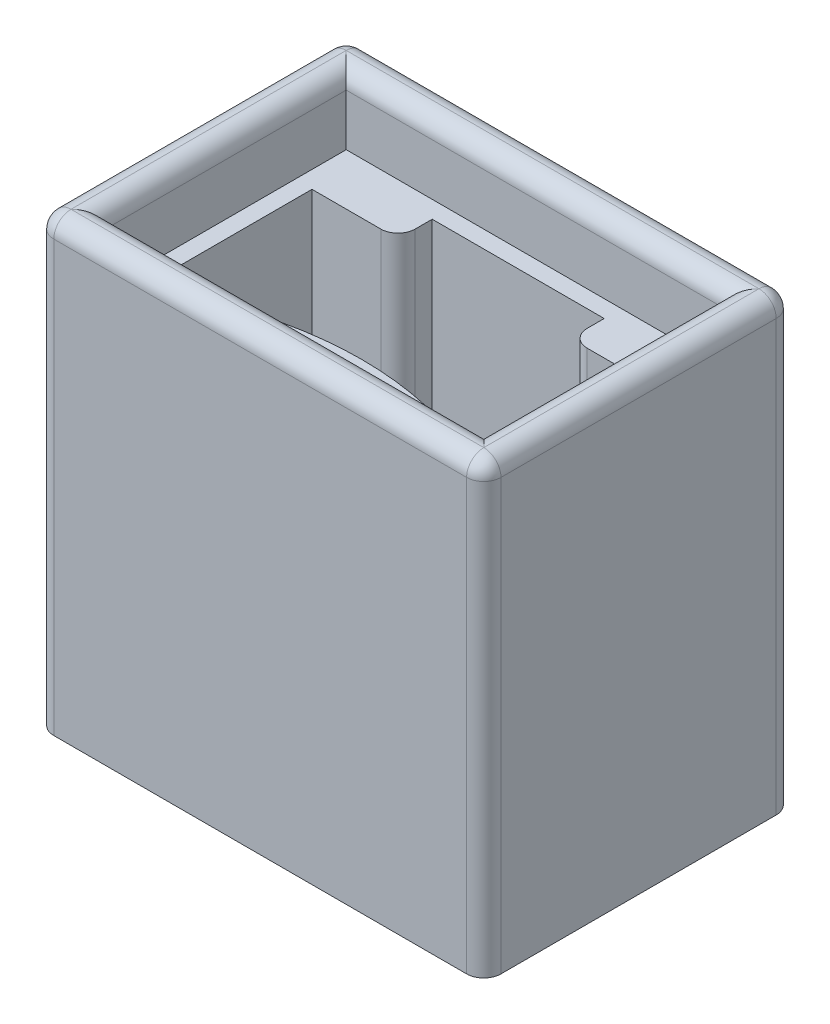
ISO-10303-21;
HEADER;
FILE_DESCRIPTION(('STEP AP214'),'2;1');
FILE_NAME('part.step','',(''),(''),'','','');
FILE_SCHEMA(('AUTOMOTIVE_DESIGN { 1 0 10303 214 1 1 1 1 }'));
ENDSEC;
DATA;
#1=APPLICATION_CONTEXT('core data for automotive mechanical design processes');
#2=APPLICATION_PROTOCOL_DEFINITION('international standard','automotive_design',2000,#1);
#3=PRODUCT_CONTEXT('',#1,'mechanical');
#4=PRODUCT('Part','Part','',(#3));
#5=PRODUCT_RELATED_PRODUCT_CATEGORY('part','',(#4));
#6=PRODUCT_DEFINITION_FORMATION('','',#4);
#7=PRODUCT_DEFINITION_CONTEXT('part definition',#1,'design');
#8=PRODUCT_DEFINITION('design','',#6,#7);
#9=PRODUCT_DEFINITION_SHAPE('','',#8);
#10=(LENGTH_UNIT() NAMED_UNIT(*) SI_UNIT(.MILLI.,.METRE.));
#11=(NAMED_UNIT(*) PLANE_ANGLE_UNIT() SI_UNIT($,.RADIAN.));
#12=(NAMED_UNIT(*) SI_UNIT($,.STERADIAN.) SOLID_ANGLE_UNIT());
#13=UNCERTAINTY_MEASURE_WITH_UNIT(LENGTH_MEASURE(1.E-05),#10,'distance_accuracy_value','');
#14=(GEOMETRIC_REPRESENTATION_CONTEXT(3) GLOBAL_UNCERTAINTY_ASSIGNED_CONTEXT((#13)) GLOBAL_UNIT_ASSIGNED_CONTEXT((#10,
#11,#12)) REPRESENTATION_CONTEXT('',''));
#15=CARTESIAN_POINT('',(0.,0.,0.));
#16=DIRECTION('',(0.,0.,1.));
#17=DIRECTION('',(1.,0.,0.));
#18=AXIS2_PLACEMENT_3D('',#15,#16,#17);
#19=CARTESIAN_POINT('',(0.,0.,0.));
#20=DIRECTION('',(0.,1.,0.));
#21=DIRECTION('',(0.,0.,1.));
#22=AXIS2_PLACEMENT_3D('',#19,#20,#21);
#23=PLANE('',#22);
#24=CARTESIAN_POINT('',(-176.825260756343,0.,123.858478650784));
#25=DIRECTION('',(0.,-1.,0.));
#26=DIRECTION('',(0.,0.,-1.));
#27=AXIS2_PLACEMENT_3D('',#24,#25,#26);
#28=CIRCLE('',#27,1.);
#29=CARTESIAN_POINT('',(-175.825260756343,0.,123.858478650784));
#30=VERTEX_POINT('',#29);
#31=CARTESIAN_POINT('',(-176.825260756343,0.,124.858478650784));
#32=VERTEX_POINT('',#31);
#33=EDGE_CURVE('E236',#30,#32,#28,.T.);
#34=ORIENTED_EDGE('',*,*,#33,.F.);
#35=DIRECTION('',(0.,0.,-1.));
#36=VECTOR('',#35,1.);
#37=CARTESIAN_POINT('',(-175.825260756343,0.,123.858478650784));
#38=LINE('',#37,#36);
#39=CARTESIAN_POINT('',(-175.825260756343,0.,122.86986711204));
#40=VERTEX_POINT('',#39);
#41=EDGE_CURVE('E229',#30,#40,#38,.T.);
#42=ORIENTED_EDGE('',*,*,#41,.T.);
#43=DIRECTION('',(1.,0.,0.));
#44=VECTOR('',#43,1.);
#45=CARTESIAN_POINT('',(-175.825260756343,0.,122.86986711204));
#46=LINE('',#45,#44);
#47=CARTESIAN_POINT('',(-165.825260756343,0.,122.86986711204));
#48=VERTEX_POINT('',#47);
#49=EDGE_CURVE('E262',#40,#48,#46,.T.);
#50=ORIENTED_EDGE('',*,*,#49,.T.);
#51=DIRECTION('',(0.,0.,-1.));
#52=VECTOR('',#51,1.);
#53=CARTESIAN_POINT('',(-165.825260756343,0.,123.858478650784));
#54=LINE('',#53,#52);
#55=CARTESIAN_POINT('',(-165.825260756343,0.,123.858478650784));
#56=VERTEX_POINT('',#55);
#57=EDGE_CURVE('E265',#56,#48,#54,.T.);
#58=ORIENTED_EDGE('',*,*,#57,.F.);
#59=CARTESIAN_POINT('',(-164.825260756343,0.,123.858478650784));
#60=DIRECTION('',(0.,1.,0.));
#61=DIRECTION('',(0.,0.,1.));
#62=AXIS2_PLACEMENT_3D('',#59,#60,#61);
#63=CIRCLE('',#62,1.);
#64=CARTESIAN_POINT('',(-164.825260756343,0.,124.858478650784));
#65=VERTEX_POINT('',#64);
#66=EDGE_CURVE('E268',#56,#65,#63,.T.);
#67=ORIENTED_EDGE('',*,*,#66,.T.);
#68=DIRECTION('',(-1.,0.,0.));
#69=VECTOR('',#68,1.);
#70=CARTESIAN_POINT('',(-160.825260756343,0.,124.858478650784));
#71=LINE('',#70,#69);
#72=CARTESIAN_POINT('',(-160.825260756343,0.,124.858478650784));
#73=VERTEX_POINT('',#72);
#74=EDGE_CURVE('E271',#73,#65,#71,.T.);
#75=ORIENTED_EDGE('',*,*,#74,.F.);
#76=DIRECTION('',(0.,0.,-1.));
#77=VECTOR('',#76,1.);
#78=CARTESIAN_POINT('',(-160.825260756343,0.,134.86986711204));
#79=LINE('',#78,#77);
#80=CARTESIAN_POINT('',(-160.825260756343,0.,134.86986711204));
#81=VERTEX_POINT('',#80);
#82=EDGE_CURVE('E274',#81,#73,#79,.T.);
#83=ORIENTED_EDGE('',*,*,#82,.F.);
#84=CARTESIAN_POINT('',(-170.825260756343,0.,150.710751296036));
#85=DIRECTION('',(0.,-1.,0.));
#86=DIRECTION('',(0.,0.,-1.));
#87=AXIS2_PLACEMENT_3D('',#84,#85,#86);
#88=CIRCLE('',#87,18.7332221395787);
#89=CARTESIAN_POINT('',(-180.825260756343,0.,134.86986711204));
#90=VERTEX_POINT('',#89);
#91=EDGE_CURVE('E277',#90,#81,#88,.T.);
#92=ORIENTED_EDGE('',*,*,#91,.F.);
#93=DIRECTION('',(0.,0.,-1.));
#94=VECTOR('',#93,1.);
#95=CARTESIAN_POINT('',(-180.825260756343,0.,134.86986711204));
#96=LINE('',#95,#94);
#97=CARTESIAN_POINT('',(-180.825260756343,0.,124.858478650784));
#98=VERTEX_POINT('',#97);
#99=EDGE_CURVE('E280',#90,#98,#96,.T.);
#100=ORIENTED_EDGE('',*,*,#99,.T.);
#101=DIRECTION('',(1.,0.,0.));
#102=VECTOR('',#101,1.);
#103=CARTESIAN_POINT('',(-180.825260756343,0.,124.858478650784));
#104=LINE('',#103,#102);
#105=EDGE_CURVE('E283',#98,#32,#104,.T.);
#106=ORIENTED_EDGE('',*,*,#105,.T.);
#107=EDGE_LOOP('',(#34,#42,#50,#58,#67,#75,#83,#92,#100,#106));
#108=FACE_BOUND('',#107,.T.);
#109=DIRECTION('',(1.,0.,0.));
#110=VECTOR('',#109,1.);
#111=CARTESIAN_POINT('',(-181.825260756343,0.,121.86986711204));
#112=LINE('',#111,#110);
#113=CARTESIAN_POINT('',(-181.825260756343,0.,121.86986711204));
#114=VERTEX_POINT('',#113);
#115=CARTESIAN_POINT('',(-159.825260756343,0.,121.86986711204));
#116=VERTEX_POINT('',#115);
#117=EDGE_CURVE('E213',#114,#116,#112,.T.);
#118=ORIENTED_EDGE('',*,*,#117,.F.);
#119=DIRECTION('',(0.,0.,-1.));
#120=VECTOR('',#119,1.);
#121=CARTESIAN_POINT('',(-181.825260756343,0.,121.86986711204));
#122=LINE('',#121,#120);
#123=CARTESIAN_POINT('',(-181.825260756343,0.,135.86986711204));
#124=VERTEX_POINT('',#123);
#125=EDGE_CURVE('E219',#124,#114,#122,.T.);
#126=ORIENTED_EDGE('',*,*,#125,.F.);
#127=DIRECTION('',(-1.,0.,0.));
#128=VECTOR('',#127,1.);
#129=CARTESIAN_POINT('',(-181.825260756343,0.,135.86986711204));
#130=LINE('',#129,#128);
#131=CARTESIAN_POINT('',(-159.825260756343,0.,135.86986711204));
#132=VERTEX_POINT('',#131);
#133=EDGE_CURVE('E222',#132,#124,#130,.T.);
#134=ORIENTED_EDGE('',*,*,#133,.F.);
#135=DIRECTION('',(0.,0.,1.));
#136=VECTOR('',#135,1.);
#137=CARTESIAN_POINT('',(-159.825260756343,0.,121.86986711204));
#138=LINE('',#137,#136);
#139=EDGE_CURVE('E204',#116,#132,#138,.T.);
#140=ORIENTED_EDGE('',*,*,#139,.F.);
#141=EDGE_LOOP('',(#118,#126,#134,#140));
#142=FACE_BOUND('',#141,.T.);
#143=ADVANCED_FACE('F36',(#108,#142),#23,.T.);
#144=CARTESIAN_POINT('',(-175.825260756343,-18.,123.858478650784));
#145=DIRECTION('',(1.,0.,0.));
#146=DIRECTION('',(0.,0.,-1.));
#147=AXIS2_PLACEMENT_3D('',#144,#145,#146);
#148=PLANE('',#147);
#149=ORIENTED_EDGE('',*,*,#41,.F.);
#150=DIRECTION('',(0.,1.,0.));
#151=VECTOR('',#150,1.);
#152=CARTESIAN_POINT('',(-175.825260756343,-18.,123.858478650784));
#153=LINE('',#152,#151);
#154=CARTESIAN_POINT('',(-175.825260756343,-18.,123.858478650784));
#155=VERTEX_POINT('',#154);
#156=EDGE_CURVE('E259',#155,#30,#153,.T.);
#157=ORIENTED_EDGE('',*,*,#156,.F.);
#158=DIRECTION('',(0.,0.,-1.));
#159=VECTOR('',#158,1.);
#160=CARTESIAN_POINT('',(-175.825260756343,-18.,123.858478650784));
#161=LINE('',#160,#159);
#162=CARTESIAN_POINT('',(-175.825260756343,-18.,122.86986711204));
#163=VERTEX_POINT('',#162);
#164=EDGE_CURVE('E232',#155,#163,#161,.T.);
#165=ORIENTED_EDGE('',*,*,#164,.T.);
#166=DIRECTION('',(0.,1.,0.));
#167=VECTOR('',#166,1.);
#168=CARTESIAN_POINT('',(-175.825260756343,-18.,122.86986711204));
#169=LINE('',#168,#167);
#170=EDGE_CURVE('E306',#163,#40,#169,.T.);
#171=ORIENTED_EDGE('',*,*,#170,.T.);
#172=EDGE_LOOP('',(#149,#157,#165,#171));
#173=FACE_BOUND('',#172,.T.);
#174=ADVANCED_FACE('F500',(#173),#148,.T.);
#175=CARTESIAN_POINT('',(-175.825260756343,-18.,122.86986711204));
#176=DIRECTION('',(0.,0.,1.));
#177=DIRECTION('',(1.,0.,0.));
#178=AXIS2_PLACEMENT_3D('',#175,#176,#177);
#179=PLANE('',#178);
#180=ORIENTED_EDGE('',*,*,#49,.F.);
#181=ORIENTED_EDGE('',*,*,#170,.F.);
#182=DIRECTION('',(1.,0.,0.));
#183=VECTOR('',#182,1.);
#184=CARTESIAN_POINT('',(-175.825260756343,-18.,122.86986711204));
#185=LINE('',#184,#183);
#186=CARTESIAN_POINT('',(-165.825260756343,-18.,122.86986711204));
#187=VERTEX_POINT('',#186);
#188=EDGE_CURVE('E235',#163,#187,#185,.T.);
#189=ORIENTED_EDGE('',*,*,#188,.T.);
#190=DIRECTION('',(0.,1.,0.));
#191=VECTOR('',#190,1.);
#192=CARTESIAN_POINT('',(-165.825260756343,-18.,122.86986711204));
#193=LINE('',#192,#191);
#194=EDGE_CURVE('E304',#187,#48,#193,.T.);
#195=ORIENTED_EDGE('',*,*,#194,.T.);
#196=EDGE_LOOP('',(#180,#181,#189,#195));
#197=FACE_BOUND('',#196,.T.);
#198=ADVANCED_FACE('F506',(#197),#179,.T.);
#199=CARTESIAN_POINT('',(-165.825260756343,-18.,123.858478650784));
#200=DIRECTION('',(1.,0.,0.));
#201=DIRECTION('',(0.,0.,-1.));
#202=AXIS2_PLACEMENT_3D('',#199,#200,#201);
#203=PLANE('',#202);
#204=ORIENTED_EDGE('',*,*,#57,.T.);
#205=ORIENTED_EDGE('',*,*,#194,.F.);
#206=DIRECTION('',(0.,0.,-1.));
#207=VECTOR('',#206,1.);
#208=CARTESIAN_POINT('',(-165.825260756343,-18.,123.858478650784));
#209=LINE('',#208,#207);
#210=CARTESIAN_POINT('',(-165.825260756343,-18.,123.858478650784));
#211=VERTEX_POINT('',#210);
#212=EDGE_CURVE('E238',#211,#187,#209,.T.);
#213=ORIENTED_EDGE('',*,*,#212,.F.);
#214=DIRECTION('',(0.,1.,0.));
#215=VECTOR('',#214,1.);
#216=CARTESIAN_POINT('',(-165.825260756343,-18.,123.858478650784));
#217=LINE('',#216,#215);
#218=EDGE_CURVE('E302',#211,#56,#217,.T.);
#219=ORIENTED_EDGE('',*,*,#218,.T.);
#220=EDGE_LOOP('',(#204,#205,#213,#219));
#221=FACE_BOUND('',#220,.T.);
#222=ADVANCED_FACE('F761',(#221),#203,.F.);
#223=CARTESIAN_POINT('',(-164.825260756343,-18.,123.858478650784));
#224=DIRECTION('',(0.,1.,0.));
#225=DIRECTION('',(0.,0.,1.));
#226=AXIS2_PLACEMENT_3D('',#223,#224,#225);
#227=CYLINDRICAL_SURFACE('',#226,1.);
#228=ORIENTED_EDGE('',*,*,#66,.F.);
#229=ORIENTED_EDGE('',*,*,#218,.F.);
#230=CARTESIAN_POINT('',(-164.825260756343,-18.,123.858478650784));
#231=DIRECTION('',(0.,1.,0.));
#232=DIRECTION('',(0.,0.,1.));
#233=AXIS2_PLACEMENT_3D('',#230,#231,#232);
#234=CIRCLE('',#233,1.);
#235=CARTESIAN_POINT('',(-164.825260756343,-18.,124.858478650784));
#236=VERTEX_POINT('',#235);
#237=EDGE_CURVE('E241',#211,#236,#234,.T.);
#238=ORIENTED_EDGE('',*,*,#237,.T.);
#239=DIRECTION('',(0.,1.,0.));
#240=VECTOR('',#239,1.);
#241=CARTESIAN_POINT('',(-164.825260756343,-18.,124.858478650784));
#242=LINE('',#241,#240);
#243=EDGE_CURVE('E300',#236,#65,#242,.T.);
#244=ORIENTED_EDGE('',*,*,#243,.T.);
#245=EDGE_LOOP('',(#228,#229,#238,#244));
#246=FACE_BOUND('',#245,.T.);
#247=ADVANCED_FACE('F751',(#246),#227,.T.);
#248=CARTESIAN_POINT('',(-160.825260756343,-18.,124.858478650784));
#249=DIRECTION('',(0.,0.,-1.));
#250=DIRECTION('',(-1.,0.,0.));
#251=AXIS2_PLACEMENT_3D('',#248,#249,#250);
#252=PLANE('',#251);
#253=ORIENTED_EDGE('',*,*,#74,.T.);
#254=ORIENTED_EDGE('',*,*,#243,.F.);
#255=DIRECTION('',(-1.,0.,0.));
#256=VECTOR('',#255,1.);
#257=CARTESIAN_POINT('',(-160.825260756343,-18.,124.858478650784));
#258=LINE('',#257,#256);
#259=CARTESIAN_POINT('',(-160.825260756343,-18.,124.858478650784));
#260=VERTEX_POINT('',#259);
#261=EDGE_CURVE('E243',#260,#236,#258,.T.);
#262=ORIENTED_EDGE('',*,*,#261,.F.);
#263=DIRECTION('',(0.,1.,0.));
#264=VECTOR('',#263,1.);
#265=CARTESIAN_POINT('',(-160.825260756343,-18.,124.858478650784));
#266=LINE('',#265,#264);
#267=EDGE_CURVE('E298',#260,#73,#266,.T.);
#268=ORIENTED_EDGE('',*,*,#267,.T.);
#269=EDGE_LOOP('',(#253,#254,#262,#268));
#270=FACE_BOUND('',#269,.T.);
#271=ADVANCED_FACE('F741',(#270),#252,.F.);
#272=CARTESIAN_POINT('',(-160.825260756343,-18.,134.86986711204));
#273=DIRECTION('',(1.,0.,0.));
#274=DIRECTION('',(0.,0.,-1.));
#275=AXIS2_PLACEMENT_3D('',#272,#273,#274);
#276=PLANE('',#275);
#277=ORIENTED_EDGE('',*,*,#82,.T.);
#278=ORIENTED_EDGE('',*,*,#267,.F.);
#279=DIRECTION('',(0.,0.,-1.));
#280=VECTOR('',#279,1.);
#281=CARTESIAN_POINT('',(-160.825260756343,-18.,134.86986711204));
#282=LINE('',#281,#280);
#283=CARTESIAN_POINT('',(-160.825260756343,-18.,134.86986711204));
#284=VERTEX_POINT('',#283);
#285=EDGE_CURVE('E246',#284,#260,#282,.T.);
#286=ORIENTED_EDGE('',*,*,#285,.F.);
#287=DIRECTION('',(0.,1.,0.));
#288=VECTOR('',#287,1.);
#289=CARTESIAN_POINT('',(-160.825260756343,-18.,134.86986711204));
#290=LINE('',#289,#288);
#291=EDGE_CURVE('E296',#284,#81,#290,.T.);
#292=ORIENTED_EDGE('',*,*,#291,.T.);
#293=EDGE_LOOP('',(#277,#278,#286,#292));
#294=FACE_BOUND('',#293,.T.);
#295=ADVANCED_FACE('F731',(#294),#276,.F.);
#296=CARTESIAN_POINT('',(-170.825260756343,-18.,150.710751296036));
#297=DIRECTION('',(0.,1.,0.));
#298=DIRECTION('',(0.,0.,1.));
#299=AXIS2_PLACEMENT_3D('',#296,#297,#298);
#300=CYLINDRICAL_SURFACE('',#299,18.7332221395787);
#301=ORIENTED_EDGE('',*,*,#91,.T.);
#302=ORIENTED_EDGE('',*,*,#291,.F.);
#303=CARTESIAN_POINT('',(-170.825260756343,-18.,150.710751296036));
#304=DIRECTION('',(0.,-1.,0.));
#305=DIRECTION('',(0.,0.,-1.));
#306=AXIS2_PLACEMENT_3D('',#303,#304,#305);
#307=CIRCLE('',#306,18.7332221395787);
#308=CARTESIAN_POINT('',(-180.825260756343,-18.,134.86986711204));
#309=VERTEX_POINT('',#308);
#310=EDGE_CURVE('E249',#309,#284,#307,.T.);
#311=ORIENTED_EDGE('',*,*,#310,.F.);
#312=DIRECTION('',(0.,1.,0.));
#313=VECTOR('',#312,1.);
#314=CARTESIAN_POINT('',(-180.825260756343,-18.,134.86986711204));
#315=LINE('',#314,#313);
#316=EDGE_CURVE('E294',#309,#90,#315,.T.);
#317=ORIENTED_EDGE('',*,*,#316,.T.);
#318=EDGE_LOOP('',(#301,#302,#311,#317));
#319=FACE_BOUND('',#318,.T.);
#320=ADVANCED_FACE('F721',(#319),#300,.T.);
#321=CARTESIAN_POINT('',(-180.825260756343,-18.,134.86986711204));
#322=DIRECTION('',(1.,0.,0.));
#323=DIRECTION('',(0.,0.,-1.));
#324=AXIS2_PLACEMENT_3D('',#321,#322,#323);
#325=PLANE('',#324);
#326=ORIENTED_EDGE('',*,*,#99,.F.);
#327=ORIENTED_EDGE('',*,*,#316,.F.);
#328=DIRECTION('',(0.,0.,-1.));
#329=VECTOR('',#328,1.);
#330=CARTESIAN_POINT('',(-180.825260756343,-18.,134.86986711204));
#331=LINE('',#330,#329);
#332=CARTESIAN_POINT('',(-180.825260756343,-18.,124.858478650784));
#333=VERTEX_POINT('',#332);
#334=EDGE_CURVE('E252',#309,#333,#331,.T.);
#335=ORIENTED_EDGE('',*,*,#334,.T.);
#336=DIRECTION('',(0.,1.,0.));
#337=VECTOR('',#336,1.);
#338=CARTESIAN_POINT('',(-180.825260756343,-18.,124.858478650784));
#339=LINE('',#338,#337);
#340=EDGE_CURVE('E292',#333,#98,#339,.T.);
#341=ORIENTED_EDGE('',*,*,#340,.T.);
#342=EDGE_LOOP('',(#326,#327,#335,#341));
#343=FACE_BOUND('',#342,.T.);
#344=ADVANCED_FACE('F711',(#343),#325,.T.);
#345=CARTESIAN_POINT('',(-180.825260756343,-18.,124.858478650784));
#346=DIRECTION('',(0.,0.,1.));
#347=DIRECTION('',(1.,0.,0.));
#348=AXIS2_PLACEMENT_3D('',#345,#346,#347);
#349=PLANE('',#348);
#350=ORIENTED_EDGE('',*,*,#105,.F.);
#351=ORIENTED_EDGE('',*,*,#340,.F.);
#352=DIRECTION('',(1.,0.,0.));
#353=VECTOR('',#352,1.);
#354=CARTESIAN_POINT('',(-180.825260756343,-18.,124.858478650784));
#355=LINE('',#354,#353);
#356=CARTESIAN_POINT('',(-176.825260756343,-18.,124.858478650784));
#357=VERTEX_POINT('',#356);
#358=EDGE_CURVE('E254',#333,#357,#355,.T.);
#359=ORIENTED_EDGE('',*,*,#358,.T.);
#360=DIRECTION('',(0.,1.,0.));
#361=VECTOR('',#360,1.);
#362=CARTESIAN_POINT('',(-176.825260756343,-18.,124.858478650784));
#363=LINE('',#362,#361);
#364=EDGE_CURVE('E290',#357,#32,#363,.T.);
#365=ORIENTED_EDGE('',*,*,#364,.T.);
#366=EDGE_LOOP('',(#350,#351,#359,#365));
#367=FACE_BOUND('',#366,.T.);
#368=ADVANCED_FACE('F701',(#367),#349,.T.);
#369=CARTESIAN_POINT('',(-176.825260756343,-18.,123.858478650784));
#370=DIRECTION('',(0.,1.,0.));
#371=DIRECTION('',(0.,0.,1.));
#372=AXIS2_PLACEMENT_3D('',#369,#370,#371);
#373=CYLINDRICAL_SURFACE('',#372,1.);
#374=ORIENTED_EDGE('',*,*,#33,.T.);
#375=ORIENTED_EDGE('',*,*,#364,.F.);
#376=CARTESIAN_POINT('',(-176.825260756343,-18.,123.858478650784));
#377=DIRECTION('',(0.,-1.,0.));
#378=DIRECTION('',(0.,0.,-1.));
#379=AXIS2_PLACEMENT_3D('',#376,#377,#378);
#380=CIRCLE('',#379,1.);
#381=EDGE_CURVE('E256',#155,#357,#380,.T.);
#382=ORIENTED_EDGE('',*,*,#381,.F.);
#383=ORIENTED_EDGE('',*,*,#156,.T.);
#384=EDGE_LOOP('',(#374,#375,#382,#383));
#385=FACE_BOUND('',#384,.T.);
#386=ADVANCED_FACE('F495',(#385),#373,.T.);
#387=CARTESIAN_POINT('',(-164.825260756343,-18.,123.858478650784));
#388=DIRECTION('',(0.,1.,0.));
#389=DIRECTION('',(0.,0.,1.));
#390=AXIS2_PLACEMENT_3D('',#387,#388,#389);
#391=PLANE('',#390);
#392=ORIENTED_EDGE('',*,*,#164,.F.);
#393=ORIENTED_EDGE('',*,*,#381,.T.);
#394=ORIENTED_EDGE('',*,*,#358,.F.);
#395=ORIENTED_EDGE('',*,*,#334,.F.);
#396=ORIENTED_EDGE('',*,*,#310,.T.);
#397=ORIENTED_EDGE('',*,*,#285,.T.);
#398=ORIENTED_EDGE('',*,*,#261,.T.);
#399=ORIENTED_EDGE('',*,*,#237,.F.);
#400=ORIENTED_EDGE('',*,*,#212,.T.);
#401=ORIENTED_EDGE('',*,*,#188,.F.);
#402=EDGE_LOOP('',(#392,#393,#394,#395,#396,#397,#398,#399,#400,#401));
#403=FACE_BOUND('',#402,.T.);
#404=ADVANCED_FACE('F488',(#403),#391,.T.);
#405=CARTESIAN_POINT('',(-181.825260756343,4.,121.86986711204));
#406=DIRECTION('',(-1.,0.,0.));
#407=DIRECTION('',(0.,0.,1.));
#408=AXIS2_PLACEMENT_3D('',#405,#406,#407);
#409=PLANE('',#408);
#410=DIRECTION('',(0.,-1.,0.));
#411=VECTOR('',#410,1.);
#412=CARTESIAN_POINT('',(-181.825260756343,4.,121.86986711204));
#413=LINE('',#412,#411);
#414=CARTESIAN_POINT('',(-181.825260756343,3.,121.86986711204));
#415=VERTEX_POINT('',#414);
#416=EDGE_CURVE('E210',#415,#114,#413,.T.);
#417=ORIENTED_EDGE('',*,*,#416,.F.);
#418=DIRECTION('',(0.,0.,-1.));
#419=VECTOR('',#418,1.);
#420=CARTESIAN_POINT('',(-181.825260756343,3.,135.86986711204));
#421=LINE('',#420,#419);
#422=CARTESIAN_POINT('',(-181.825260756343,3.,135.86986711204));
#423=VERTEX_POINT('',#422);
#424=EDGE_CURVE('E337',#415,#423,#421,.F.);
#425=ORIENTED_EDGE('',*,*,#424,.T.);
#426=DIRECTION('',(0.,-1.,0.));
#427=VECTOR('',#426,1.);
#428=CARTESIAN_POINT('',(-181.825260756343,4.,135.86986711204));
#429=LINE('',#428,#427);
#430=EDGE_CURVE('E227',#423,#124,#429,.T.);
#431=ORIENTED_EDGE('',*,*,#430,.T.);
#432=ORIENTED_EDGE('',*,*,#125,.T.);
#433=EDGE_LOOP('',(#417,#425,#431,#432));
#434=FACE_BOUND('',#433,.T.);
#435=ADVANCED_FACE('F486',(#434),#409,.F.);
#436=CARTESIAN_POINT('',(-181.825260756343,4.,135.86986711204));
#437=DIRECTION('',(0.,0.,1.));
#438=DIRECTION('',(1.,0.,0.));
#439=AXIS2_PLACEMENT_3D('',#436,#437,#438);
#440=PLANE('',#439);
#441=ORIENTED_EDGE('',*,*,#430,.F.);
#442=DIRECTION('',(-1.,0.,0.));
#443=VECTOR('',#442,1.);
#444=CARTESIAN_POINT('',(-159.825260756343,3.,135.86986711204));
#445=LINE('',#444,#443);
#446=CARTESIAN_POINT('',(-159.825260756343,3.,135.86986711204));
#447=VERTEX_POINT('',#446);
#448=EDGE_CURVE('E331',#423,#447,#445,.F.);
#449=ORIENTED_EDGE('',*,*,#448,.T.);
#450=DIRECTION('',(0.,-1.,0.));
#451=VECTOR('',#450,1.);
#452=CARTESIAN_POINT('',(-159.825260756343,4.,135.86986711204));
#453=LINE('',#452,#451);
#454=EDGE_CURVE('E209',#447,#132,#453,.T.);
#455=ORIENTED_EDGE('',*,*,#454,.T.);
#456=ORIENTED_EDGE('',*,*,#133,.T.);
#457=EDGE_LOOP('',(#441,#449,#455,#456));
#458=FACE_BOUND('',#457,.T.);
#459=ADVANCED_FACE('F484',(#458),#440,.F.);
#460=CARTESIAN_POINT('',(-159.825260756343,4.,121.86986711204));
#461=DIRECTION('',(1.,0.,0.));
#462=DIRECTION('',(0.,0.,-1.));
#463=AXIS2_PLACEMENT_3D('',#460,#461,#462);
#464=PLANE('',#463);
#465=ORIENTED_EDGE('',*,*,#454,.F.);
#466=DIRECTION('',(0.,0.,1.));
#467=VECTOR('',#466,1.);
#468=CARTESIAN_POINT('',(-159.825260756343,3.,121.86986711204));
#469=LINE('',#468,#467);
#470=CARTESIAN_POINT('',(-159.825260756343,3.,121.86986711204));
#471=VERTEX_POINT('',#470);
#472=EDGE_CURVE('E206',#447,#471,#469,.F.);
#473=ORIENTED_EDGE('',*,*,#472,.T.);
#474=DIRECTION('',(0.,-1.,0.));
#475=VECTOR('',#474,1.);
#476=CARTESIAN_POINT('',(-159.825260756343,4.,121.86986711204));
#477=LINE('',#476,#475);
#478=EDGE_CURVE('E199',#471,#116,#477,.T.);
#479=ORIENTED_EDGE('',*,*,#478,.T.);
#480=ORIENTED_EDGE('',*,*,#139,.T.);
#481=EDGE_LOOP('',(#465,#473,#479,#480));
#482=FACE_BOUND('',#481,.T.);
#483=ADVANCED_FACE('F202',(#482),#464,.F.);
#484=CARTESIAN_POINT('',(-181.825260756343,4.,121.86986711204));
#485=DIRECTION('',(0.,0.,-1.));
#486=DIRECTION('',(-1.,0.,0.));
#487=AXIS2_PLACEMENT_3D('',#484,#485,#486);
#488=PLANE('',#487);
#489=ORIENTED_EDGE('',*,*,#478,.F.);
#490=DIRECTION('',(1.,0.,0.));
#491=VECTOR('',#490,1.);
#492=CARTESIAN_POINT('',(-181.825260756343,3.,121.86986711204));
#493=LINE('',#492,#491);
#494=EDGE_CURVE('E335',#471,#415,#493,.F.);
#495=ORIENTED_EDGE('',*,*,#494,.T.);
#496=ORIENTED_EDGE('',*,*,#416,.T.);
#497=ORIENTED_EDGE('',*,*,#117,.T.);
#498=EDGE_LOOP('',(#489,#495,#496,#497));
#499=FACE_BOUND('',#498,.T.);
#500=ADVANCED_FACE('F214',(#499),#488,.F.);
#501=CARTESIAN_POINT('',(0.,-22.,0.));
#502=DIRECTION('',(0.,1.,0.));
#503=DIRECTION('',(0.,0.,1.));
#504=AXIS2_PLACEMENT_3D('',#501,#502,#503);
#505=PLANE('',#504);
#506=DIRECTION('',(0.,0.,1.));
#507=VECTOR('',#506,1.);
#508=CARTESIAN_POINT('',(-157.825260756343,-22.,119.86986711204));
#509=LINE('',#508,#507);
#510=CARTESIAN_POINT('',(-157.825260756343,-22.,120.86986711204));
#511=VERTEX_POINT('',#510);
#512=CARTESIAN_POINT('',(-157.825260756343,-22.,136.86986711204));
#513=VERTEX_POINT('',#512);
#514=EDGE_CURVE('E315',#511,#513,#509,.T.);
#515=ORIENTED_EDGE('',*,*,#514,.T.);
#516=CARTESIAN_POINT('',(-158.825260756343,-22.,136.86986711204));
#517=DIRECTION('',(0.,1.,0.));
#518=DIRECTION('',(0.,0.,1.));
#519=AXIS2_PLACEMENT_3D('',#516,#517,#518);
#520=CIRCLE('',#519,1.);
#521=CARTESIAN_POINT('',(-158.825260756343,-22.,137.86986711204));
#522=VERTEX_POINT('',#521);
#523=EDGE_CURVE('E397',#513,#522,#520,.F.);
#524=ORIENTED_EDGE('',*,*,#523,.T.);
#525=DIRECTION('',(1.,0.,0.));
#526=VECTOR('',#525,1.);
#527=CARTESIAN_POINT('',(-183.825260756343,-22.,137.86986711204));
#528=LINE('',#527,#526);
#529=CARTESIAN_POINT('',(-182.825260756343,-22.,137.86986711204));
#530=VERTEX_POINT('',#529);
#531=EDGE_CURVE('E312',#530,#522,#528,.T.);
#532=ORIENTED_EDGE('',*,*,#531,.F.);
#533=CARTESIAN_POINT('',(-182.825260756343,-22.,136.86986711204));
#534=DIRECTION('',(0.,1.,0.));
#535=DIRECTION('',(0.,0.,1.));
#536=AXIS2_PLACEMENT_3D('',#533,#534,#535);
#537=CIRCLE('',#536,1.);
#538=CARTESIAN_POINT('',(-183.825260756343,-22.,136.86986711204));
#539=VERTEX_POINT('',#538);
#540=EDGE_CURVE('E395',#530,#539,#537,.F.);
#541=ORIENTED_EDGE('',*,*,#540,.T.);
#542=DIRECTION('',(0.,0.,1.));
#543=VECTOR('',#542,1.);
#544=CARTESIAN_POINT('',(-183.825260756343,-22.,119.86986711204));
#545=LINE('',#544,#543);
#546=CARTESIAN_POINT('',(-183.825260756343,-22.,120.86986711204));
#547=VERTEX_POINT('',#546);
#548=EDGE_CURVE('E309',#547,#539,#545,.T.);
#549=ORIENTED_EDGE('',*,*,#548,.F.);
#550=CARTESIAN_POINT('',(-182.825260756343,-22.,120.86986711204));
#551=DIRECTION('',(0.,1.,0.));
#552=DIRECTION('',(0.,0.,1.));
#553=AXIS2_PLACEMENT_3D('',#550,#551,#552);
#554=CIRCLE('',#553,1.);
#555=CARTESIAN_POINT('',(-182.825260756343,-22.,119.86986711204));
#556=VERTEX_POINT('',#555);
#557=EDGE_CURVE('E59',#547,#556,#554,.F.);
#558=ORIENTED_EDGE('',*,*,#557,.T.);
#559=DIRECTION('',(1.,0.,0.));
#560=VECTOR('',#559,1.);
#561=CARTESIAN_POINT('',(-183.825260756343,-22.,119.86986711204));
#562=LINE('',#561,#560);
#563=CARTESIAN_POINT('',(-158.825260756343,-22.,119.86986711204));
#564=VERTEX_POINT('',#563);
#565=EDGE_CURVE('E318',#556,#564,#562,.T.);
#566=ORIENTED_EDGE('',*,*,#565,.T.);
#567=CARTESIAN_POINT('',(-158.825260756343,-22.,120.86986711204));
#568=DIRECTION('',(0.,1.,0.));
#569=DIRECTION('',(0.,0.,1.));
#570=AXIS2_PLACEMENT_3D('',#567,#568,#569);
#571=CIRCLE('',#570,1.);
#572=EDGE_CURVE('E392',#564,#511,#571,.F.);
#573=ORIENTED_EDGE('',*,*,#572,.T.);
#574=EDGE_LOOP('',(#515,#524,#532,#541,#549,#558,#566,#573));
#575=FACE_BOUND('',#574,.T.);
#576=ADVANCED_FACE('F463',(#575),#505,.F.);
#577=CARTESIAN_POINT('',(-183.825260756343,-22.,119.86986711204));
#578=DIRECTION('',(0.,0.,1.));
#579=DIRECTION('',(1.,0.,0.));
#580=AXIS2_PLACEMENT_3D('',#577,#578,#579);
#581=PLANE('',#580);
#582=ORIENTED_EDGE('',*,*,#565,.F.);
#583=DIRECTION('',(0.,1.,0.));
#584=VECTOR('',#583,1.);
#585=CARTESIAN_POINT('',(-182.825260756343,3.,119.86986711204));
#586=LINE('',#585,#584);
#587=CARTESIAN_POINT('',(-182.825260756343,3.,119.86986711204));
#588=VERTEX_POINT('',#587);
#589=EDGE_CURVE('E11',#556,#588,#586,.T.);
#590=ORIENTED_EDGE('',*,*,#589,.T.);
#591=DIRECTION('',(1.,0.,0.));
#592=VECTOR('',#591,1.);
#593=CARTESIAN_POINT('',(-157.825260756343,3.,119.86986711204));
#594=LINE('',#593,#592);
#595=CARTESIAN_POINT('',(-158.825260756343,3.,119.86986711204));
#596=VERTEX_POINT('',#595);
#597=EDGE_CURVE('E320',#588,#596,#594,.T.);
#598=ORIENTED_EDGE('',*,*,#597,.T.);
#599=DIRECTION('',(0.,1.,0.));
#600=VECTOR('',#599,1.);
#601=CARTESIAN_POINT('',(-158.825260756343,-22.,119.86986711204));
#602=LINE('',#601,#600);
#603=EDGE_CURVE('E45',#596,#564,#602,.F.);
#604=ORIENTED_EDGE('',*,*,#603,.T.);
#605=EDGE_LOOP('',(#582,#590,#598,#604));
#606=FACE_BOUND('',#605,.T.);
#607=ADVANCED_FACE('F424',(#606),#581,.F.);
#608=CARTESIAN_POINT('',(-157.825260756343,-22.,119.86986711204));
#609=DIRECTION('',(-1.,0.,0.));
#610=DIRECTION('',(0.,0.,1.));
#611=AXIS2_PLACEMENT_3D('',#608,#609,#610);
#612=PLANE('',#611);
#613=DIRECTION('',(0.,0.,1.));
#614=VECTOR('',#613,1.);
#615=CARTESIAN_POINT('',(-157.825260756343,3.,137.86986711204));
#616=LINE('',#615,#614);
#617=CARTESIAN_POINT('',(-157.825260756343,3.,120.86986711204));
#618=VERTEX_POINT('',#617);
#619=CARTESIAN_POINT('',(-157.825260756343,3.,136.86986711204));
#620=VERTEX_POINT('',#619);
#621=EDGE_CURVE('E322',#618,#620,#616,.T.);
#622=ORIENTED_EDGE('',*,*,#621,.T.);
#623=DIRECTION('',(0.,1.,0.));
#624=VECTOR('',#623,1.);
#625=CARTESIAN_POINT('',(-157.825260756343,-22.,136.86986711204));
#626=LINE('',#625,#624);
#627=EDGE_CURVE('E390',#620,#513,#626,.F.);
#628=ORIENTED_EDGE('',*,*,#627,.T.);
#629=ORIENTED_EDGE('',*,*,#514,.F.);
#630=DIRECTION('',(0.,1.,0.));
#631=VECTOR('',#630,1.);
#632=CARTESIAN_POINT('',(-157.825260756343,-22.,120.86986711204));
#633=LINE('',#632,#631);
#634=EDGE_CURVE('E388',#511,#618,#633,.T.);
#635=ORIENTED_EDGE('',*,*,#634,.T.);
#636=EDGE_LOOP('',(#622,#628,#629,#635));
#637=FACE_BOUND('',#636,.T.);
#638=ADVANCED_FACE('F462',(#637),#612,.F.);
#639=CARTESIAN_POINT('',(-183.825260756343,-22.,137.86986711204));
#640=DIRECTION('',(0.,0.,1.));
#641=DIRECTION('',(1.,0.,0.));
#642=AXIS2_PLACEMENT_3D('',#639,#640,#641);
#643=PLANE('',#642);
#644=ORIENTED_EDGE('',*,*,#531,.T.);
#645=DIRECTION('',(0.,1.,0.));
#646=VECTOR('',#645,1.);
#647=CARTESIAN_POINT('',(-158.825260756343,3.,137.86986711204));
#648=LINE('',#647,#646);
#649=CARTESIAN_POINT('',(-158.825260756343,3.,137.86986711204));
#650=VERTEX_POINT('',#649);
#651=EDGE_CURVE('E386',#522,#650,#648,.T.);
#652=ORIENTED_EDGE('',*,*,#651,.T.);
#653=DIRECTION('',(-1.,0.,0.));
#654=VECTOR('',#653,1.);
#655=CARTESIAN_POINT('',(-183.825260756343,3.,137.86986711204));
#656=LINE('',#655,#654);
#657=CARTESIAN_POINT('',(-182.825260756343,3.,137.86986711204));
#658=VERTEX_POINT('',#657);
#659=EDGE_CURVE('E325',#650,#658,#656,.T.);
#660=ORIENTED_EDGE('',*,*,#659,.T.);
#661=DIRECTION('',(0.,1.,0.));
#662=VECTOR('',#661,1.);
#663=CARTESIAN_POINT('',(-182.825260756343,-22.,137.86986711204));
#664=LINE('',#663,#662);
#665=EDGE_CURVE('E384',#658,#530,#664,.F.);
#666=ORIENTED_EDGE('',*,*,#665,.T.);
#667=EDGE_LOOP('',(#644,#652,#660,#666));
#668=FACE_BOUND('',#667,.T.);
#669=ADVANCED_FACE('F467',(#668),#643,.T.);
#670=CARTESIAN_POINT('',(-183.825260756343,-22.,119.86986711204));
#671=DIRECTION('',(-1.,0.,0.));
#672=DIRECTION('',(0.,0.,1.));
#673=AXIS2_PLACEMENT_3D('',#670,#671,#672);
#674=PLANE('',#673);
#675=ORIENTED_EDGE('',*,*,#548,.T.);
#676=DIRECTION('',(0.,1.,0.));
#677=VECTOR('',#676,1.);
#678=CARTESIAN_POINT('',(-183.825260756343,-22.,136.86986711204));
#679=LINE('',#678,#677);
#680=CARTESIAN_POINT('',(-183.825260756343,3.,136.86986711204));
#681=VERTEX_POINT('',#680);
#682=EDGE_CURVE('E401',#539,#681,#679,.T.);
#683=ORIENTED_EDGE('',*,*,#682,.T.);
#684=DIRECTION('',(0.,0.,-1.));
#685=VECTOR('',#684,1.);
#686=CARTESIAN_POINT('',(-183.825260756343,3.,119.86986711204));
#687=LINE('',#686,#685);
#688=CARTESIAN_POINT('',(-183.825260756343,3.,120.86986711204));
#689=VERTEX_POINT('',#688);
#690=EDGE_CURVE('E328',#681,#689,#687,.T.);
#691=ORIENTED_EDGE('',*,*,#690,.T.);
#692=DIRECTION('',(0.,1.,0.));
#693=VECTOR('',#692,1.);
#694=CARTESIAN_POINT('',(-183.825260756343,-22.,120.86986711204));
#695=LINE('',#694,#693);
#696=EDGE_CURVE('E399',#689,#547,#695,.F.);
#697=ORIENTED_EDGE('',*,*,#696,.T.);
#698=EDGE_LOOP('',(#675,#683,#691,#697));
#699=FACE_BOUND('',#698,.T.);
#700=ADVANCED_FACE('F518',(#699),#674,.T.);
#701=CARTESIAN_POINT('',(0.,3.,136.86986711204));
#702=DIRECTION('',(1.,0.,0.));
#703=DIRECTION('',(0.,0.,-1.));
#704=AXIS2_PLACEMENT_3D('',#701,#702,#703);
#705=CYLINDRICAL_SURFACE('',#704,1.);
#706=CARTESIAN_POINT('',(-158.825260756343,3.,136.86986711204));
#707=DIRECTION('',(0.707106781186547,0.,-0.707106781186547));
#708=DIRECTION('',(0.707106781186547,0.,0.707106781186547));
#709=AXIS2_PLACEMENT_3D('',#706,#707,#708);
#710=ELLIPSE('',#709,1.41421356237309,1.);
#711=CARTESIAN_POINT('',(-158.825260756343,4.,136.86986711204));
#712=VERTEX_POINT('',#711);
#713=EDGE_CURVE('E356',#447,#712,#710,.T.);
#714=ORIENTED_EDGE('',*,*,#713,.F.);
#715=ORIENTED_EDGE('',*,*,#448,.F.);
#716=CARTESIAN_POINT('',(-182.825260756343,3.,136.86986711204));
#717=DIRECTION('',(0.707106781186547,0.,0.707106781186547));
#718=DIRECTION('',(0.707106781186547,0.,-0.707106781186547));
#719=AXIS2_PLACEMENT_3D('',#716,#717,#718);
#720=ELLIPSE('',#719,1.41421356237309,1.);
#721=CARTESIAN_POINT('',(-182.825260756343,4.,136.86986711204));
#722=VERTEX_POINT('',#721);
#723=EDGE_CURVE('E362',#722,#423,#720,.F.);
#724=ORIENTED_EDGE('',*,*,#723,.F.);
#725=DIRECTION('',(-1.,0.,0.));
#726=VECTOR('',#725,1.);
#727=CARTESIAN_POINT('',(-181.825260756343,4.,136.86986711204));
#728=LINE('',#727,#726);
#729=EDGE_CURVE('E359',#712,#722,#728,.T.);
#730=ORIENTED_EDGE('',*,*,#729,.F.);
#731=EDGE_LOOP('',(#714,#715,#724,#730));
#732=FACE_BOUND('',#731,.T.);
#733=ADVANCED_FACE('F480',(#732),#705,.T.);
#734=CARTESIAN_POINT('',(-182.825260756343,3.,0.));
#735=DIRECTION('',(0.,0.,1.));
#736=DIRECTION('',(1.,0.,0.));
#737=AXIS2_PLACEMENT_3D('',#734,#735,#736);
#738=CYLINDRICAL_SURFACE('',#737,1.);
#739=ORIENTED_EDGE('',*,*,#723,.T.);
#740=ORIENTED_EDGE('',*,*,#424,.F.);
#741=CARTESIAN_POINT('',(-182.825260756343,3.,120.86986711204));
#742=DIRECTION('',(-0.707106781186547,0.,0.707106781186547));
#743=DIRECTION('',(-0.707106781186547,0.,-0.707106781186547));
#744=AXIS2_PLACEMENT_3D('',#741,#742,#743);
#745=ELLIPSE('',#744,1.41421356237309,1.);
#746=CARTESIAN_POINT('',(-182.825260756343,4.,120.86986711204));
#747=VERTEX_POINT('',#746);
#748=EDGE_CURVE('E350',#747,#415,#745,.F.);
#749=ORIENTED_EDGE('',*,*,#748,.F.);
#750=DIRECTION('',(0.,0.,-1.));
#751=VECTOR('',#750,1.);
#752=CARTESIAN_POINT('',(-182.825260756343,4.,121.86986711204));
#753=LINE('',#752,#751);
#754=EDGE_CURVE('E347',#722,#747,#753,.T.);
#755=ORIENTED_EDGE('',*,*,#754,.F.);
#756=EDGE_LOOP('',(#739,#740,#749,#755));
#757=FACE_BOUND('',#756,.T.);
#758=ADVANCED_FACE('F434',(#757),#738,.T.);
#759=CARTESIAN_POINT('',(-183.825260756343,3.,136.86986711204));
#760=DIRECTION('',(-1.,0.,0.));
#761=DIRECTION('',(0.,0.,1.));
#762=AXIS2_PLACEMENT_3D('',#759,#760,#761);
#763=CYLINDRICAL_SURFACE('',#762,1.);
#764=ORIENTED_EDGE('',*,*,#659,.F.);
#765=CARTESIAN_POINT('',(-158.825260756343,3.,136.86986711204));
#766=DIRECTION('',(-1.,0.,0.));
#767=DIRECTION('',(0.,0.,1.));
#768=AXIS2_PLACEMENT_3D('',#765,#766,#767);
#769=CIRCLE('',#768,1.);
#770=EDGE_CURVE('E371',#650,#712,#769,.T.);
#771=ORIENTED_EDGE('',*,*,#770,.T.);
#772=ORIENTED_EDGE('',*,*,#729,.T.);
#773=CARTESIAN_POINT('',(-182.825260756343,3.,136.86986711204));
#774=DIRECTION('',(-1.,0.,0.));
#775=DIRECTION('',(0.,0.,1.));
#776=AXIS2_PLACEMENT_3D('',#773,#774,#775);
#777=CIRCLE('',#776,1.);
#778=EDGE_CURVE('E369',#722,#658,#777,.F.);
#779=ORIENTED_EDGE('',*,*,#778,.T.);
#780=EDGE_LOOP('',(#764,#771,#772,#779));
#781=FACE_BOUND('',#780,.T.);
#782=ADVANCED_FACE('F477',(#781),#763,.T.);
#783=CARTESIAN_POINT('',(-158.825260756343,3.,0.));
#784=DIRECTION('',(0.,0.,-1.));
#785=DIRECTION('',(-1.,0.,0.));
#786=AXIS2_PLACEMENT_3D('',#783,#784,#785);
#787=CYLINDRICAL_SURFACE('',#786,1.);
#788=CARTESIAN_POINT('',(-158.825260756343,3.,120.86986711204));
#789=DIRECTION('',(-0.707106781186547,0.,-0.707106781186547));
#790=DIRECTION('',(0.707106781186547,0.,-0.707106781186547));
#791=AXIS2_PLACEMENT_3D('',#788,#789,#790);
#792=ELLIPSE('',#791,1.41421356237309,1.);
#793=CARTESIAN_POINT('',(-158.825260756343,4.,120.86986711204));
#794=VERTEX_POINT('',#793);
#795=EDGE_CURVE('E353',#471,#794,#792,.T.);
#796=ORIENTED_EDGE('',*,*,#795,.F.);
#797=ORIENTED_EDGE('',*,*,#472,.F.);
#798=ORIENTED_EDGE('',*,*,#713,.T.);
#799=DIRECTION('',(0.,0.,1.));
#800=VECTOR('',#799,1.);
#801=CARTESIAN_POINT('',(-158.825260756343,4.,135.86986711204));
#802=LINE('',#801,#800);
#803=EDGE_CURVE('E343',#794,#712,#802,.T.);
#804=ORIENTED_EDGE('',*,*,#803,.F.);
#805=EDGE_LOOP('',(#796,#797,#798,#804));
#806=FACE_BOUND('',#805,.T.);
#807=ADVANCED_FACE('F445',(#806),#787,.T.);
#808=CARTESIAN_POINT('',(0.,3.,120.86986711204));
#809=DIRECTION('',(-1.,0.,0.));
#810=DIRECTION('',(0.,0.,1.));
#811=AXIS2_PLACEMENT_3D('',#808,#809,#810);
#812=CYLINDRICAL_SURFACE('',#811,1.);
#813=ORIENTED_EDGE('',*,*,#494,.F.);
#814=ORIENTED_EDGE('',*,*,#795,.T.);
#815=DIRECTION('',(1.,0.,0.));
#816=VECTOR('',#815,1.);
#817=CARTESIAN_POINT('',(-159.825260756343,4.,120.86986711204));
#818=LINE('',#817,#816);
#819=EDGE_CURVE('E340',#747,#794,#818,.T.);
#820=ORIENTED_EDGE('',*,*,#819,.F.);
#821=ORIENTED_EDGE('',*,*,#748,.T.);
#822=EDGE_LOOP('',(#813,#814,#820,#821));
#823=FACE_BOUND('',#822,.T.);
#824=ADVANCED_FACE('F442',(#823),#812,.T.);
#825=CARTESIAN_POINT('',(-182.825260756343,3.,119.86986711204));
#826=DIRECTION('',(0.,0.,-1.));
#827=DIRECTION('',(-1.,0.,0.));
#828=AXIS2_PLACEMENT_3D('',#825,#826,#827);
#829=CYLINDRICAL_SURFACE('',#828,1.);
#830=ORIENTED_EDGE('',*,*,#690,.F.);
#831=CARTESIAN_POINT('',(-182.825260756343,3.,136.86986711204));
#832=DIRECTION('',(0.,0.,-1.));
#833=DIRECTION('',(-1.,0.,0.));
#834=AXIS2_PLACEMENT_3D('',#831,#832,#833);
#835=CIRCLE('',#834,1.);
#836=EDGE_CURVE('E375',#681,#722,#835,.T.);
#837=ORIENTED_EDGE('',*,*,#836,.T.);
#838=ORIENTED_EDGE('',*,*,#754,.T.);
#839=CARTESIAN_POINT('',(-182.825260756343,3.,120.86986711204));
#840=DIRECTION('',(0.,0.,-1.));
#841=DIRECTION('',(-1.,0.,0.));
#842=AXIS2_PLACEMENT_3D('',#839,#840,#841);
#843=CIRCLE('',#842,1.);
#844=EDGE_CURVE('E373',#747,#689,#843,.F.);
#845=ORIENTED_EDGE('',*,*,#844,.T.);
#846=EDGE_LOOP('',(#830,#837,#838,#845));
#847=FACE_BOUND('',#846,.T.);
#848=ADVANCED_FACE('F439',(#847),#829,.T.);
#849=CARTESIAN_POINT('',(-158.825260756343,3.,119.86986711204));
#850=DIRECTION('',(0.,0.,-1.));
#851=DIRECTION('',(-1.,0.,0.));
#852=AXIS2_PLACEMENT_3D('',#849,#850,#851);
#853=CYLINDRICAL_SURFACE('',#852,1.);
#854=ORIENTED_EDGE('',*,*,#803,.T.);
#855=CARTESIAN_POINT('',(-158.825260756343,3.,136.86986711204));
#856=DIRECTION('',(0.,0.,-1.));
#857=DIRECTION('',(-1.,0.,0.));
#858=AXIS2_PLACEMENT_3D('',#855,#856,#857);
#859=CIRCLE('',#858,1.);
#860=EDGE_CURVE('E366',#712,#620,#859,.T.);
#861=ORIENTED_EDGE('',*,*,#860,.T.);
#862=ORIENTED_EDGE('',*,*,#621,.F.);
#863=CARTESIAN_POINT('',(-158.825260756343,3.,120.86986711204));
#864=DIRECTION('',(0.,0.,-1.));
#865=DIRECTION('',(-1.,0.,0.));
#866=AXIS2_PLACEMENT_3D('',#863,#864,#865);
#867=CIRCLE('',#866,1.);
#868=EDGE_CURVE('E339',#618,#794,#867,.F.);
#869=ORIENTED_EDGE('',*,*,#868,.T.);
#870=EDGE_LOOP('',(#854,#861,#862,#869));
#871=FACE_BOUND('',#870,.T.);
#872=ADVANCED_FACE('F449',(#871),#853,.T.);
#873=CARTESIAN_POINT('',(-183.825260756343,3.,120.86986711204));
#874=DIRECTION('',(-1.,0.,0.));
#875=DIRECTION('',(0.,0.,1.));
#876=AXIS2_PLACEMENT_3D('',#873,#874,#875);
#877=CYLINDRICAL_SURFACE('',#876,1.);
#878=ORIENTED_EDGE('',*,*,#597,.F.);
#879=CARTESIAN_POINT('',(-182.825260756343,3.,120.86986711204));
#880=DIRECTION('',(-1.,0.,0.));
#881=DIRECTION('',(0.,0.,1.));
#882=AXIS2_PLACEMENT_3D('',#879,#880,#881);
#883=CIRCLE('',#882,1.);
#884=EDGE_CURVE('E381',#588,#747,#883,.F.);
#885=ORIENTED_EDGE('',*,*,#884,.T.);
#886=ORIENTED_EDGE('',*,*,#819,.T.);
#887=CARTESIAN_POINT('',(-158.825260756343,3.,120.86986711204));
#888=DIRECTION('',(-1.,0.,0.));
#889=DIRECTION('',(0.,0.,1.));
#890=AXIS2_PLACEMENT_3D('',#887,#888,#889);
#891=CIRCLE('',#890,1.);
#892=EDGE_CURVE('E378',#794,#596,#891,.T.);
#893=ORIENTED_EDGE('',*,*,#892,.T.);
#894=EDGE_LOOP('',(#878,#885,#886,#893));
#895=FACE_BOUND('',#894,.T.);
#896=ADVANCED_FACE('F422',(#895),#877,.T.);
#897=CARTESIAN_POINT('',(-158.825260756343,-22.,136.86986711204));
#898=DIRECTION('',(0.,-1.,0.));
#899=DIRECTION('',(0.,0.,-1.));
#900=AXIS2_PLACEMENT_3D('',#897,#898,#899);
#901=CYLINDRICAL_SURFACE('',#900,1.);
#902=ORIENTED_EDGE('',*,*,#523,.F.);
#903=ORIENTED_EDGE('',*,*,#627,.F.);
#904=CARTESIAN_POINT('',(-158.825260756343,3.,136.86986711204));
#905=DIRECTION('',(0.,1.,0.));
#906=DIRECTION('',(0.,0.,1.));
#907=AXIS2_PLACEMENT_3D('',#904,#905,#906);
#908=CIRCLE('',#907,1.);
#909=EDGE_CURVE('E344',#650,#620,#908,.T.);
#910=ORIENTED_EDGE('',*,*,#909,.F.);
#911=ORIENTED_EDGE('',*,*,#651,.F.);
#912=EDGE_LOOP('',(#902,#903,#910,#911));
#913=FACE_BOUND('',#912,.T.);
#914=ADVANCED_FACE('F459',(#913),#901,.T.);
#915=CARTESIAN_POINT('',(-158.825260756343,3.,136.86986711204));
#916=DIRECTION('',(0.,0.,1.));
#917=DIRECTION('',(1.,0.,0.));
#918=AXIS2_PLACEMENT_3D('',#915,#916,#917);
#919=SPHERICAL_SURFACE('',#918,1.);
#920=ORIENTED_EDGE('',*,*,#860,.F.);
#921=ORIENTED_EDGE('',*,*,#770,.F.);
#922=ORIENTED_EDGE('',*,*,#909,.T.);
#923=EDGE_LOOP('',(#920,#921,#922));
#924=FACE_BOUND('',#923,.T.);
#925=ADVANCED_FACE('F453',(#924),#919,.T.);
#926=CARTESIAN_POINT('',(-182.825260756343,-22.,136.86986711204));
#927=DIRECTION('',(0.,1.,0.));
#928=DIRECTION('',(0.,0.,1.));
#929=AXIS2_PLACEMENT_3D('',#926,#927,#928);
#930=CYLINDRICAL_SURFACE('',#929,1.);
#931=ORIENTED_EDGE('',*,*,#540,.F.);
#932=ORIENTED_EDGE('',*,*,#665,.F.);
#933=CARTESIAN_POINT('',(-182.825260756343,3.,136.86986711204));
#934=DIRECTION('',(0.,1.,0.));
#935=DIRECTION('',(0.,0.,1.));
#936=AXIS2_PLACEMENT_3D('',#933,#934,#935);
#937=CIRCLE('',#936,1.);
#938=EDGE_CURVE('E405',#681,#658,#937,.T.);
#939=ORIENTED_EDGE('',*,*,#938,.F.);
#940=ORIENTED_EDGE('',*,*,#682,.F.);
#941=EDGE_LOOP('',(#931,#932,#939,#940));
#942=FACE_BOUND('',#941,.T.);
#943=ADVANCED_FACE('F472',(#942),#930,.T.);
#944=CARTESIAN_POINT('',(-182.825260756343,3.,136.86986711204));
#945=DIRECTION('',(0.,0.,1.));
#946=DIRECTION('',(1.,0.,0.));
#947=AXIS2_PLACEMENT_3D('',#944,#945,#946);
#948=SPHERICAL_SURFACE('',#947,1.);
#949=ORIENTED_EDGE('',*,*,#938,.T.);
#950=ORIENTED_EDGE('',*,*,#778,.F.);
#951=ORIENTED_EDGE('',*,*,#836,.F.);
#952=EDGE_LOOP('',(#949,#950,#951));
#953=FACE_BOUND('',#952,.T.);
#954=ADVANCED_FACE('F475',(#953),#948,.T.);
#955=CARTESIAN_POINT('',(-182.825260756343,-22.,120.86986711204));
#956=DIRECTION('',(0.,-1.,0.));
#957=DIRECTION('',(0.,0.,-1.));
#958=AXIS2_PLACEMENT_3D('',#955,#956,#957);
#959=CYLINDRICAL_SURFACE('',#958,1.);
#960=ORIENTED_EDGE('',*,*,#557,.F.);
#961=ORIENTED_EDGE('',*,*,#696,.F.);
#962=CARTESIAN_POINT('',(-182.825260756343,3.,120.86986711204));
#963=DIRECTION('',(0.,1.,0.));
#964=DIRECTION('',(0.,0.,1.));
#965=AXIS2_PLACEMENT_3D('',#962,#963,#964);
#966=CIRCLE('',#965,1.);
#967=EDGE_CURVE('E407',#588,#689,#966,.T.);
#968=ORIENTED_EDGE('',*,*,#967,.F.);
#969=ORIENTED_EDGE('',*,*,#589,.F.);
#970=EDGE_LOOP('',(#960,#961,#968,#969));
#971=FACE_BOUND('',#970,.T.);
#972=ADVANCED_FACE('F427',(#971),#959,.T.);
#973=CARTESIAN_POINT('',(-182.825260756343,3.,120.86986711204));
#974=DIRECTION('',(0.,0.,1.));
#975=DIRECTION('',(1.,0.,0.));
#976=AXIS2_PLACEMENT_3D('',#973,#974,#975);
#977=SPHERICAL_SURFACE('',#976,1.);
#978=ORIENTED_EDGE('',*,*,#967,.T.);
#979=ORIENTED_EDGE('',*,*,#844,.F.);
#980=ORIENTED_EDGE('',*,*,#884,.F.);
#981=EDGE_LOOP('',(#978,#979,#980));
#982=FACE_BOUND('',#981,.T.);
#983=ADVANCED_FACE('F429',(#982),#977,.T.);
#984=CARTESIAN_POINT('',(-158.825260756343,-22.,120.86986711204));
#985=DIRECTION('',(0.,1.,0.));
#986=DIRECTION('',(0.,0.,1.));
#987=AXIS2_PLACEMENT_3D('',#984,#985,#986);
#988=CYLINDRICAL_SURFACE('',#987,1.);
#989=ORIENTED_EDGE('',*,*,#572,.F.);
#990=ORIENTED_EDGE('',*,*,#603,.F.);
#991=CARTESIAN_POINT('',(-158.825260756343,3.,120.86986711204));
#992=DIRECTION('',(0.,1.,0.));
#993=DIRECTION('',(0.,0.,1.));
#994=AXIS2_PLACEMENT_3D('',#991,#992,#993);
#995=CIRCLE('',#994,1.);
#996=EDGE_CURVE('E40',#618,#596,#995,.T.);
#997=ORIENTED_EDGE('',*,*,#996,.F.);
#998=ORIENTED_EDGE('',*,*,#634,.F.);
#999=EDGE_LOOP('',(#989,#990,#997,#998));
#1000=FACE_BOUND('',#999,.T.);
#1001=ADVANCED_FACE('F38',(#1000),#988,.T.);
#1002=CARTESIAN_POINT('',(-158.825260756343,3.,120.86986711204));
#1003=DIRECTION('',(0.,0.,1.));
#1004=DIRECTION('',(1.,0.,0.));
#1005=AXIS2_PLACEMENT_3D('',#1002,#1003,#1004);
#1006=SPHERICAL_SURFACE('',#1005,1.);
#1007=ORIENTED_EDGE('',*,*,#892,.F.);
#1008=ORIENTED_EDGE('',*,*,#868,.F.);
#1009=ORIENTED_EDGE('',*,*,#996,.T.);
#1010=EDGE_LOOP('',(#1007,#1008,#1009));
#1011=FACE_BOUND('',#1010,.T.);
#1012=ADVANCED_FACE('F416',(#1011),#1006,.T.);
#1013=CLOSED_SHELL('',(#143,#174,#198,#222,#247,#271,#295,#320,#344,#368,#386,#404,#435,#459,
#483,#500,#576,#607,#638,#669,#700,#733,#758,#782,#807,#824,#848,#872,#896,#914,#925,#943,#954,
#972,#983,#1001,#1012));
#1014=MANIFOLD_SOLID_BREP('B2',#1013);
#1015=ADVANCED_BREP_SHAPE_REPRESENTATION('',(#18,#1014),#14);
#1016=SHAPE_DEFINITION_REPRESENTATION(#9,#1015);
ENDSEC;
END-ISO-10303-21;
